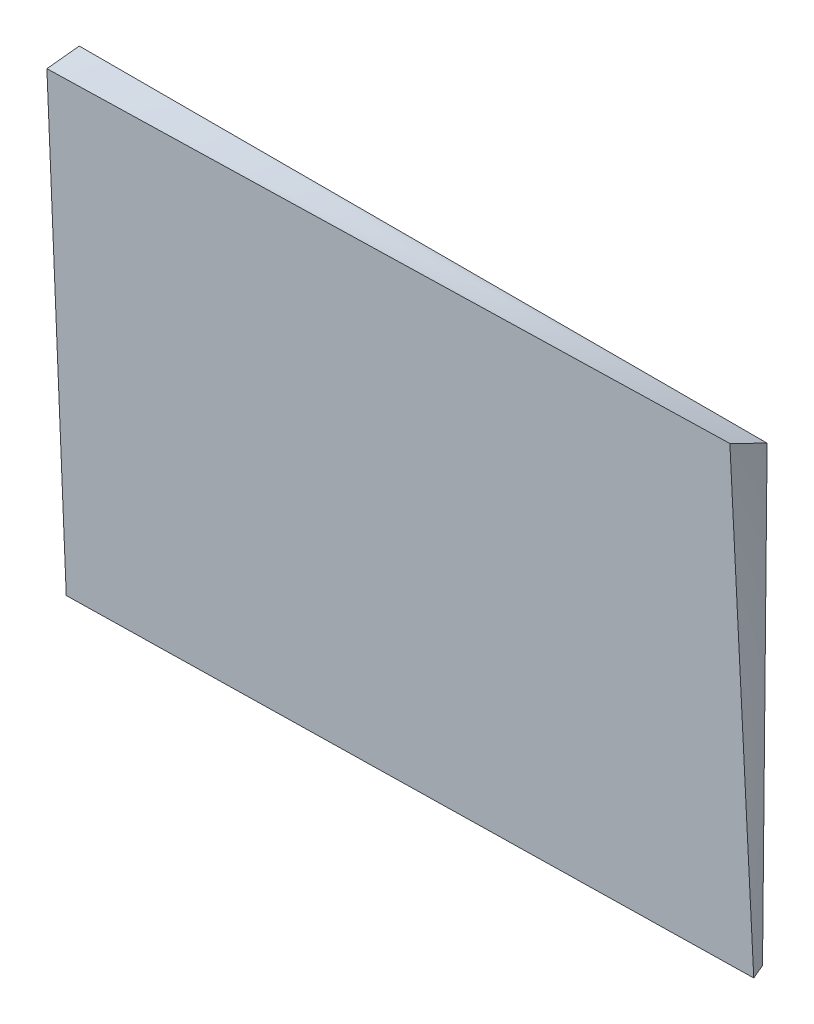
ISO-10303-21;
HEADER;
FILE_DESCRIPTION(('STEP AP214'),'2;1');
FILE_NAME('part.step','',(''),(''),'','','');
FILE_SCHEMA(('AUTOMOTIVE_DESIGN { 1 0 10303 214 1 1 1 1 }'));
ENDSEC;
DATA;
#1=APPLICATION_CONTEXT('core data for automotive mechanical design processes');
#2=APPLICATION_PROTOCOL_DEFINITION('international standard','automotive_design',2000,#1);
#3=PRODUCT_CONTEXT('',#1,'mechanical');
#4=PRODUCT('Part','Part','',(#3));
#5=PRODUCT_RELATED_PRODUCT_CATEGORY('part','',(#4));
#6=PRODUCT_DEFINITION_FORMATION('','',#4);
#7=PRODUCT_DEFINITION_CONTEXT('part definition',#1,'design');
#8=PRODUCT_DEFINITION('design','',#6,#7);
#9=PRODUCT_DEFINITION_SHAPE('','',#8);
#10=(LENGTH_UNIT() NAMED_UNIT(*) SI_UNIT(.MILLI.,.METRE.));
#11=(NAMED_UNIT(*) PLANE_ANGLE_UNIT() SI_UNIT($,.RADIAN.));
#12=(NAMED_UNIT(*) SI_UNIT($,.STERADIAN.) SOLID_ANGLE_UNIT());
#13=UNCERTAINTY_MEASURE_WITH_UNIT(LENGTH_MEASURE(1.E-05),#10,'distance_accuracy_value','');
#14=(GEOMETRIC_REPRESENTATION_CONTEXT(3) GLOBAL_UNCERTAINTY_ASSIGNED_CONTEXT((#13)) GLOBAL_UNIT_ASSIGNED_CONTEXT((#10,
#11,#12)) REPRESENTATION_CONTEXT('',''));
#15=CARTESIAN_POINT('',(0.,0.,0.));
#16=DIRECTION('',(0.,0.,1.));
#17=DIRECTION('',(1.,0.,0.));
#18=AXIS2_PLACEMENT_3D('',#15,#16,#17);
#19=CARTESIAN_POINT('',(0.,-0.01745240643728,0.999847695156391));
#20=DIRECTION('',(0.,-0.01745240643728,0.999847695156391));
#21=DIRECTION('',(0.,-0.999847695156391,-0.01745240643728));
#22=AXIS2_PLACEMENT_3D('',#19,#20,#21);
#23=PLANE('',#22);
#24=DIRECTION('',(0.999683968020641,0.0251350670336073,0.000438734227046629));
#25=VECTOR('',#24,1.);
#26=CARTESIAN_POINT('',(14.6511593959065,10.352335391785,1.18085301446616));
#27=LINE('',#26,#25);
#28=CARTESIAN_POINT('',(-15.2488406040935,9.60055930219451,1.16773071401088));
#29=VERTEX_POINT('',#28);
#30=CARTESIAN_POINT('',(14.6511593959065,10.352335391785,1.18085301446616));
#31=VERTEX_POINT('',#30);
#32=EDGE_CURVE('E126',#29,#31,#27,.T.);
#33=ORIENTED_EDGE('',*,*,#32,.F.);
#34=DIRECTION('',(-0.0251388958092055,0.999531711310233,0.0174468909187291));
#35=VECTOR('',#34,1.);
#36=CARTESIAN_POINT('',(-15.2488406040935,9.60055930219451,1.16773071401088));
#37=LINE('',#36,#35);
#38=CARTESIAN_POINT('',(-14.7485765774903,-10.2901217528791,0.820537584728174));
#39=VERTEX_POINT('',#38);
#40=EDGE_CURVE('E124',#39,#29,#37,.T.);
#41=ORIENTED_EDGE('',*,*,#40,.F.);
#42=DIRECTION('',(-0.999828384158396,-0.0185228965458351,-0.000323318361866146));
#43=VECTOR('',#42,1.);
#44=CARTESIAN_POINT('',(-14.7485765774903,-10.2901217528791,0.820537584728174));
#45=LINE('',#44,#43);
#46=CARTESIAN_POINT('',(15.3462577856774,-9.7325825668495,0.830269467420345));
#47=VERTEX_POINT('',#46);
#48=EDGE_CURVE('E60',#47,#39,#45,.T.);
#49=ORIENTED_EDGE('',*,*,#48,.F.);
#50=DIRECTION('',(0.0345820094413388,-0.999249649683308,-0.0174419675147174));
#51=VECTOR('',#50,1.);
#52=CARTESIAN_POINT('',(15.3462577856774,-9.7325825668495,0.830269467420345));
#53=LINE('',#52,#51);
#54=EDGE_CURVE('E12',#31,#47,#53,.T.);
#55=ORIENTED_EDGE('',*,*,#54,.F.);
#56=EDGE_LOOP('',(#33,#41,#49,#55));
#57=FACE_BOUND('',#56,.T.);
#58=ADVANCED_FACE('F50',(#57),#23,.T.);
#59=CARTESIAN_POINT('',(0.,0.,0.));
#60=DIRECTION('',(0.,0.,1.));
#61=DIRECTION('',(1.,0.,0.));
#62=AXIS2_PLACEMENT_3D('',#59,#60,#61);
#63=PLANE('',#62);
#64=DIRECTION('',(-1.,0.,0.));
#65=VECTOR('',#64,1.);
#66=CARTESIAN_POINT('',(15.1001689223314,9.9997470367077,0.));
#67=LINE('',#66,#65);
#68=CARTESIAN_POINT('',(15.1001689223314,9.9997470367077,0.));
#69=VERTEX_POINT('',#68);
#70=CARTESIAN_POINT('',(-14.9998310776686,9.9997470367077,0.));
#71=VERTEX_POINT('',#70);
#72=EDGE_CURVE('E99',#69,#71,#67,.T.);
#73=ORIENTED_EDGE('',*,*,#72,.F.);
#74=DIRECTION('',(0.0100842054937449,0.999949153107077,0.));
#75=VECTOR('',#74,1.);
#76=CARTESIAN_POINT('',(14.8994932330058,-9.89924111012312,0.));
#77=LINE('',#76,#75);
#78=CARTESIAN_POINT('',(14.8994932330058,-9.89924111012312,0.));
#79=VERTEX_POINT('',#78);
#80=EDGE_CURVE('E225',#79,#69,#77,.T.);
#81=ORIENTED_EDGE('',*,*,#80,.F.);
#82=DIRECTION('',(0.999977401694796,0.00672280445381868,0.));
#83=VECTOR('',#82,1.);
#84=CARTESIAN_POINT('',(-14.9998310776686,-10.1002529632923,0.));
#85=LINE('',#84,#83);
#86=CARTESIAN_POINT('',(-14.9998310776686,-10.1002529632923,0.));
#87=VERTEX_POINT('',#86);
#88=EDGE_CURVE('E101',#87,#79,#85,.T.);
#89=ORIENTED_EDGE('',*,*,#88,.F.);
#90=DIRECTION('',(0.,-1.,0.));
#91=VECTOR('',#90,1.);
#92=CARTESIAN_POINT('',(-14.9998310776686,9.9997470367077,0.));
#93=LINE('',#92,#91);
#94=EDGE_CURVE('E95',#71,#87,#93,.T.);
#95=ORIENTED_EDGE('',*,*,#94,.F.);
#96=EDGE_LOOP('',(#73,#81,#89,#95));
#97=FACE_BOUND('',#96,.T.);
#98=ADVANCED_FACE('F98',(#97),#63,.F.);
#99=CARTESIAN_POINT('',(-14.9998310776686,-10.1002529632923,0.));
#100=CARTESIAN_POINT('',(-14.7485765774903,-10.2901217528791,0.820537584728174));
#101=CARTESIAN_POINT('',(-10.0166103592228,-10.0667509877641,0.));
#102=CARTESIAN_POINT('',(-9.73277085029572,-10.1971985552075,0.822159565176869));
#103=CARTESIAN_POINT('',(-5.03338964077709,-10.0332490122359,0.));
#104=CARTESIAN_POINT('',(-4.7169651231011,-10.1042753575359,0.823781545625564));
#105=CARTESIAN_POINT('',(4.93305179611438,-9.96624506117951,0.));
#106=CARTESIAN_POINT('',(5.31464633128815,-9.91842896219271,0.827025506522954));
#107=CARTESIAN_POINT('',(9.9162725145601,-9.93274308565131,0.));
#108=CARTESIAN_POINT('',(10.3304520584828,-9.8255057645211,0.828647486971649));
#109=CARTESIAN_POINT('',(14.8994932330058,-9.89924111012312,0.));
#110=CARTESIAN_POINT('',(15.3462577856774,-9.7325825668495,0.830269467420345));
#111=B_SPLINE_SURFACE_WITH_KNOTS('',3,1,((#99,#100),(#101,#102),(#103,#104),(#105,#106),(#107,
#108),(#109,#110)),.UNSPECIFIED.,.F.,.F.,.F.,(4,2,4),(2,2),(0.,0.5,1.),(0.,1.),.UNSPECIFIED.);
#112=DIRECTION('',(0.466616521813159,0.174064010512387,0.867162465640282));
#113=VECTOR('',#112,1.);
#114=CARTESIAN_POINT('',(15.1228755093416,-9.81591183848631,0.415134733710172));
#115=LINE('',#114,#113);
#116=EDGE_CURVE('E75',#79,#47,#115,.T.);
#117=DIRECTION('',(-0.285874615596956,0.216030627107163,-0.933598667688091));
#118=VECTOR('',#117,1.);
#119=CARTESIAN_POINT('',(-14.8742038275794,-10.1951873580857,0.410268792364087));
#120=LINE('',#119,#118);
#121=EDGE_CURVE('E139',#39,#87,#120,.T.);
#122=ORIENTED_EDGE('',*,*,#88,.T.);
#123=ORIENTED_EDGE('',*,*,#116,.T.);
#124=ORIENTED_EDGE('',*,*,#48,.T.);
#125=ORIENTED_EDGE('',*,*,#121,.T.);
#126=EDGE_LOOP('',(#122,#123,#124,#125));
#127=FACE_BOUND('',#126,.T.);
#128=ADVANCED_FACE('F180',(#127),#111,.T.);
#129=CARTESIAN_POINT('',(14.8994932330058,-9.89924111012312,0.));
#130=CARTESIAN_POINT('',(15.3462577856774,-9.7325825668495,0.830269467420345));
#131=CARTESIAN_POINT('',(14.9329391812268,-6.58274308565131,0.));
#132=CARTESIAN_POINT('',(15.2304080540489,-6.38509624041039,0.888700058594648));
#133=CARTESIAN_POINT('',(14.9663851294477,-3.2662450611795,0.));
#134=CARTESIAN_POINT('',(15.1145583224204,-3.0376099139713,0.947130649768951));
#135=CARTESIAN_POINT('',(15.0332770258895,3.36675098776411,0.));
#136=CARTESIAN_POINT('',(14.8828588591634,3.65736273890687,1.06399183211756));
#137=CARTESIAN_POINT('',(15.0667229741104,6.68324901223591,0.));
#138=CARTESIAN_POINT('',(14.767009127535,7.00484906534594,1.12242242329186));
#139=CARTESIAN_POINT('',(15.1001689223314,9.99974703670771,0.));
#140=CARTESIAN_POINT('',(14.6511593959065,10.352335391785,1.18085301446616));
#141=B_SPLINE_SURFACE_WITH_KNOTS('',3,1,((#129,#130),(#131,#132),(#133,#134),(#135,#136),(#137,
#138),(#139,#140)),.UNSPECIFIED.,.F.,.F.,.F.,(4,2,4),(2,2),(0.,0.5,1.),(0.,1.),.UNSPECIFIED.);
#142=DIRECTION('',(-0.342332527196679,0.268819380325382,0.900302494489831));
#143=VECTOR('',#142,1.);
#144=CARTESIAN_POINT('',(14.8756641591189,10.1760412142464,0.590426507233082));
#145=LINE('',#144,#143);
#146=EDGE_CURVE('E117',#69,#31,#145,.T.);
#147=ORIENTED_EDGE('',*,*,#80,.T.);
#148=ORIENTED_EDGE('',*,*,#146,.T.);
#149=ORIENTED_EDGE('',*,*,#54,.T.);
#150=ORIENTED_EDGE('',*,*,#116,.F.);
#151=EDGE_LOOP('',(#147,#148,#149,#150));
#152=FACE_BOUND('',#151,.T.);
#153=ADVANCED_FACE('F151',(#152),#141,.T.);
#154=CARTESIAN_POINT('',(-14.9998310776686,9.9997470367077,0.));
#155=CARTESIAN_POINT('',(-15.2488406040935,9.60055930219451,1.16773071401088));
#156=CARTESIAN_POINT('',(-14.9998310776686,6.6497470367077,0.));
#157=CARTESIAN_POINT('',(-15.1654632663263,6.28544579301557,1.10986519246376));
#158=CARTESIAN_POINT('',(-14.9998310776686,3.2997470367077,0.));
#159=CARTESIAN_POINT('',(-15.0820859285591,2.97033228383663,1.05199967091665));
#160=CARTESIAN_POINT('',(-14.9998310776686,-3.4002529632923,0.));
#161=CARTESIAN_POINT('',(-14.9153312530247,-3.65989473452125,0.93626862782241));
#162=CARTESIAN_POINT('',(-14.9998310776686,-6.7502529632923,0.));
#163=CARTESIAN_POINT('',(-14.8319539152575,-6.9750082437002,0.878403106275292));
#164=CARTESIAN_POINT('',(-14.9998310776686,-10.1002529632923,0.));
#165=CARTESIAN_POINT('',(-14.7485765774903,-10.2901217528791,0.820537584728174));
#166=B_SPLINE_SURFACE_WITH_KNOTS('',3,1,((#154,#155),(#156,#157),(#158,#159),(#160,#161),(#162,
#163),(#164,#165)),.UNSPECIFIED.,.F.,.F.,.F.,(4,2,4),(2,2),(0.,0.5,1.),(0.,1.),.UNSPECIFIED.);
#167=DIRECTION('',(-0.197791652259587,-0.317080244698742,0.927544382074631));
#168=VECTOR('',#167,1.);
#169=CARTESIAN_POINT('',(-15.1243358408811,9.80015316945111,0.583865357005441));
#170=LINE('',#169,#168);
#171=EDGE_CURVE('E115',#71,#29,#170,.T.);
#172=ORIENTED_EDGE('',*,*,#94,.T.);
#173=ORIENTED_EDGE('',*,*,#121,.F.);
#174=ORIENTED_EDGE('',*,*,#40,.T.);
#175=ORIENTED_EDGE('',*,*,#171,.F.);
#176=EDGE_LOOP('',(#172,#173,#174,#175));
#177=FACE_BOUND('',#176,.T.);
#178=ADVANCED_FACE('F122',(#177),#166,.T.);
#179=CARTESIAN_POINT('',(15.1001689223314,9.9997470367077,0.));
#180=CARTESIAN_POINT('',(14.6511593959065,10.352335391785,1.18085301446616));
#181=CARTESIAN_POINT('',(10.0835022556647,9.9997470367077,0.));
#182=CARTESIAN_POINT('',(9.66782606257313,10.2270393768533,1.17866596439028));
#183=CARTESIAN_POINT('',(5.06683558899805,9.9997470367077,0.));
#184=CARTESIAN_POINT('',(4.68449272923979,10.1017433619215,1.1764789143144));
#185=CARTESIAN_POINT('',(-4.96649774433528,9.9997470367077,0.));
#186=CARTESIAN_POINT('',(-5.28217393742688,9.85115133205801,1.17210481416264));
#187=CARTESIAN_POINT('',(-9.98316441100195,9.9997470367077,0.));
#188=CARTESIAN_POINT('',(-10.2655072707602,9.72585531712626,1.16991776408676));
#189=CARTESIAN_POINT('',(-14.9998310776686,9.9997470367077,0.));
#190=CARTESIAN_POINT('',(-15.2488406040935,9.60055930219451,1.16773071401088));
#191=B_SPLINE_SURFACE_WITH_KNOTS('',3,1,((#179,#180),(#181,#182),(#183,#184),(#185,#186),(#187,
#188),(#189,#190)),.UNSPECIFIED.,.F.,.F.,.F.,(4,2,4),(2,2),(0.,0.5,1.),(0.,1.),.UNSPECIFIED.);
#192=ORIENTED_EDGE('',*,*,#72,.T.);
#193=ORIENTED_EDGE('',*,*,#171,.T.);
#194=ORIENTED_EDGE('',*,*,#32,.T.);
#195=ORIENTED_EDGE('',*,*,#146,.F.);
#196=EDGE_LOOP('',(#192,#193,#194,#195));
#197=FACE_BOUND('',#196,.T.);
#198=ADVANCED_FACE('F114',(#197),#191,.T.);
#199=CLOSED_SHELL('',(#58,#98,#128,#153,#178,#198));
#200=MANIFOLD_SOLID_BREP('B2',#199);
#201=ADVANCED_BREP_SHAPE_REPRESENTATION('',(#18,#200),#14);
#202=SHAPE_DEFINITION_REPRESENTATION(#9,#201);
ENDSEC;
END-ISO-10303-21;
